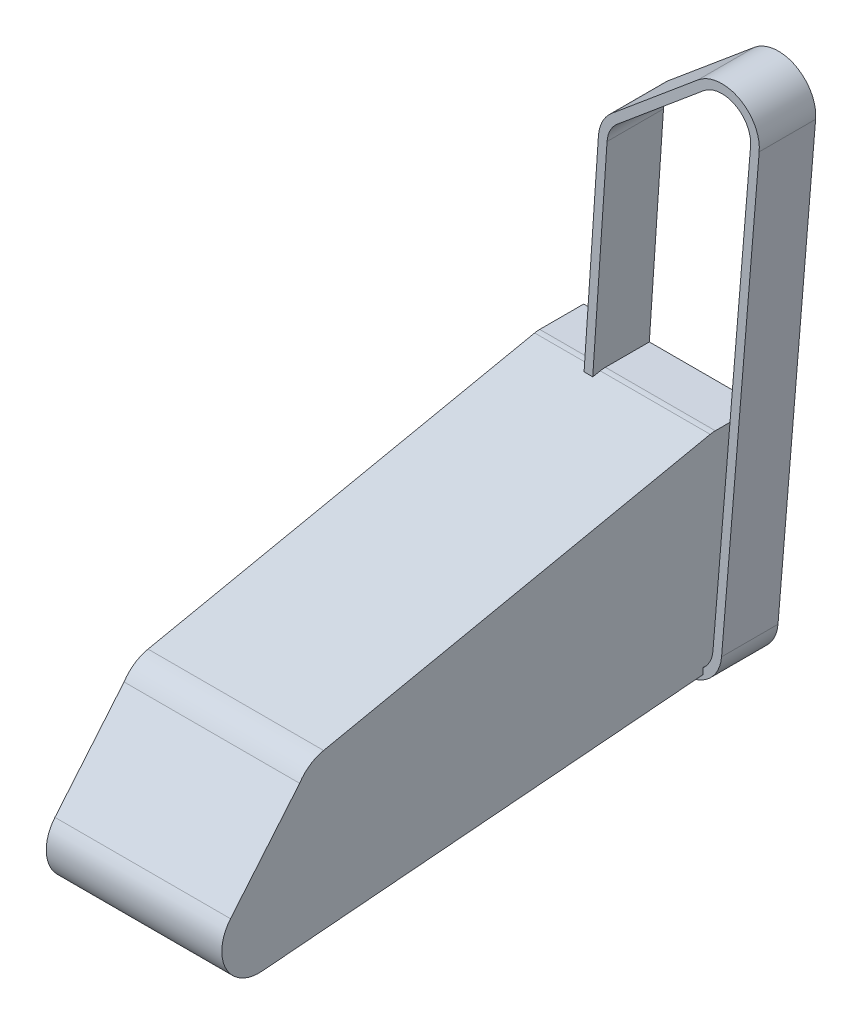
ISO-10303-21;
HEADER;
FILE_DESCRIPTION(('STEP AP214'),'2;1');
FILE_NAME('part.step','',(''),(''),'','','');
FILE_SCHEMA(('AUTOMOTIVE_DESIGN { 1 0 10303 214 1 1 1 1 }'));
ENDSEC;
DATA;
#1=APPLICATION_CONTEXT('core data for automotive mechanical design processes');
#2=APPLICATION_PROTOCOL_DEFINITION('international standard','automotive_design',2000,#1);
#3=PRODUCT_CONTEXT('',#1,'mechanical');
#4=PRODUCT('Part','Part','',(#3));
#5=PRODUCT_RELATED_PRODUCT_CATEGORY('part','',(#4));
#6=PRODUCT_DEFINITION_FORMATION('','',#4);
#7=PRODUCT_DEFINITION_CONTEXT('part definition',#1,'design');
#8=PRODUCT_DEFINITION('design','',#6,#7);
#9=PRODUCT_DEFINITION_SHAPE('','',#8);
#10=(LENGTH_UNIT() NAMED_UNIT(*) SI_UNIT(.MILLI.,.METRE.));
#11=(NAMED_UNIT(*) PLANE_ANGLE_UNIT() SI_UNIT($,.RADIAN.));
#12=(NAMED_UNIT(*) SI_UNIT($,.STERADIAN.) SOLID_ANGLE_UNIT());
#13=UNCERTAINTY_MEASURE_WITH_UNIT(LENGTH_MEASURE(1.E-05),#10,'distance_accuracy_value','');
#14=(GEOMETRIC_REPRESENTATION_CONTEXT(3) GLOBAL_UNCERTAINTY_ASSIGNED_CONTEXT((#13)) GLOBAL_UNIT_ASSIGNED_CONTEXT((#10,
#11,#12)) REPRESENTATION_CONTEXT('',''));
#15=CARTESIAN_POINT('',(0.,0.,0.));
#16=DIRECTION('',(0.,0.,1.));
#17=DIRECTION('',(1.,0.,0.));
#18=AXIS2_PLACEMENT_3D('',#15,#16,#17);
#19=CARTESIAN_POINT('',(-14.0026551876531,5.93465518765291,79.746));
#20=DIRECTION('',(1.,0.,0.));
#21=DIRECTION('',(0.,1.,0.));
#22=AXIS2_PLACEMENT_3D('',#19,#20,#21);
#23=CYLINDRICAL_SURFACE('',#22,5.95799999999999);
#24=DIRECTION('',(1.,0.,0.));
#25=VECTOR('',#24,1.);
#26=CARTESIAN_POINT('',(-14.0026551876531,-0.0031822441173314,79.2562545213397));
#27=LINE('',#26,#25);
#28=CARTESIAN_POINT('',(-14.0026551876531,-0.0031822441173314,79.2562545213397));
#29=VERTEX_POINT('',#28);
#30=CARTESIAN_POINT('',(13.997344812347,-0.00318224411742854,79.2562545213398));
#31=VERTEX_POINT('',#30);
#32=EDGE_CURVE('E147',#29,#31,#27,.T.);
#33=ORIENTED_EDGE('',*,*,#32,.T.);
#34=CARTESIAN_POINT('',(13.997344812347,5.93465518765281,79.7460000000001));
#35=DIRECTION('',(-1.,0.,0.));
#36=DIRECTION('',(0.,-1.,0.));
#37=AXIS2_PLACEMENT_3D('',#34,#35,#36);
#38=CIRCLE('',#37,5.95799999999999);
#39=CARTESIAN_POINT('',(13.997344812347,9.75573468257518,84.3173362918827));
#40=VERTEX_POINT('',#39);
#41=EDGE_CURVE('E141',#31,#40,#38,.T.);
#42=ORIENTED_EDGE('',*,*,#41,.T.);
#43=DIRECTION('',(1.,0.,0.));
#44=VECTOR('',#43,1.);
#45=CARTESIAN_POINT('',(-14.0026551876531,9.75573468257527,84.3173362918826));
#46=LINE('',#45,#44);
#47=CARTESIAN_POINT('',(-14.0026551876531,9.75573468257527,84.3173362918826));
#48=VERTEX_POINT('',#47);
#49=EDGE_CURVE('E12',#48,#40,#46,.T.);
#50=ORIENTED_EDGE('',*,*,#49,.F.);
#51=CARTESIAN_POINT('',(-14.0026551876531,5.93465518765291,79.746));
#52=DIRECTION('',(-1.,0.,0.));
#53=DIRECTION('',(0.,-1.,0.));
#54=AXIS2_PLACEMENT_3D('',#51,#52,#53);
#55=CIRCLE('',#54,5.95799999999999);
#56=EDGE_CURVE('E170',#29,#48,#55,.T.);
#57=ORIENTED_EDGE('',*,*,#56,.F.);
#58=EDGE_LOOP('',(#33,#42,#50,#57));
#59=FACE_BOUND('',#58,.T.);
#60=ADVANCED_FACE('F52',(#59),#23,.T.);
#61=CARTESIAN_POINT('',(-14.0026551876527,60.6387446850154,41.7853470121835));
#62=DIRECTION('',(0.,-0.641335934025239,-0.767260203404278));
#63=DIRECTION('',(0.,-0.767260203404278,0.641335934025239));
#64=AXIS2_PLACEMENT_3D('',#61,#62,#63);
#65=PLANE('',#64);
#66=ORIENTED_EDGE('',*,*,#49,.T.);
#67=DIRECTION('',(0.,0.767260203404279,-0.641335934025239));
#68=VECTOR('',#67,1.);
#69=CARTESIAN_POINT('',(13.9973448123473,60.6387446850153,41.7853470121836));
#70=LINE('',#69,#68);
#71=CARTESIAN_POINT('',(13.9973448123471,22.9445773426706,73.2930726996952));
#72=VERTEX_POINT('',#71);
#73=EDGE_CURVE('E131',#40,#72,#70,.T.);
#74=ORIENTED_EDGE('',*,*,#73,.T.);
#75=DIRECTION('',(1.,0.,0.));
#76=VECTOR('',#75,1.);
#77=CARTESIAN_POINT('',(-14.002655187653,22.9445773426707,73.2930726996951));
#78=LINE('',#77,#76);
#79=CARTESIAN_POINT('',(-14.002655187653,22.9445773426707,73.2930726996951));
#80=VERTEX_POINT('',#79);
#81=EDGE_CURVE('E59',#80,#72,#78,.T.);
#82=ORIENTED_EDGE('',*,*,#81,.F.);
#83=DIRECTION('',(0.,0.767260203404279,-0.641335934025239));
#84=VECTOR('',#83,1.);
#85=CARTESIAN_POINT('',(-14.0026551876527,60.6387446850154,41.7853470121835));
#86=LINE('',#85,#84);
#87=EDGE_CURVE('E132',#48,#80,#86,.T.);
#88=ORIENTED_EDGE('',*,*,#87,.F.);
#89=EDGE_LOOP('',(#66,#74,#82,#88));
#90=FACE_BOUND('',#89,.T.);
#91=ADVANCED_FACE('F129',(#90),#65,.F.);
#92=CARTESIAN_POINT('',(-14.002655187653,19.6926435850439,68.246));
#93=DIRECTION('',(1.,0.,0.));
#94=DIRECTION('',(0.,1.,0.));
#95=AXIS2_PLACEMENT_3D('',#92,#93,#94);
#96=CYLINDRICAL_SURFACE('',#95,6.004);
#97=ORIENTED_EDGE('',*,*,#81,.T.);
#98=CARTESIAN_POINT('',(13.9973448123471,19.6926435850438,68.2460000000001));
#99=DIRECTION('',(-1.,0.,0.));
#100=DIRECTION('',(0.,-1.,0.));
#101=AXIS2_PLACEMENT_3D('',#98,#99,#100);
#102=CIRCLE('',#101,6.004);
#103=CARTESIAN_POINT('',(13.9973448123471,25.5705925480758,69.4698186091051));
#104=VERTEX_POINT('',#103);
#105=EDGE_CURVE('E145',#72,#104,#102,.T.);
#106=ORIENTED_EDGE('',*,*,#105,.T.);
#107=DIRECTION('',(1.,0.,0.));
#108=VECTOR('',#107,1.);
#109=CARTESIAN_POINT('',(-14.002655187653,25.5705925480759,69.469818609105));
#110=LINE('',#109,#108);
#111=CARTESIAN_POINT('',(-14.002655187653,25.5705925480759,69.469818609105));
#112=VERTEX_POINT('',#111);
#113=EDGE_CURVE('E202',#112,#104,#110,.T.);
#114=ORIENTED_EDGE('',*,*,#113,.F.);
#115=CARTESIAN_POINT('',(-14.002655187653,19.6926435850439,68.246));
#116=DIRECTION('',(-1.,0.,0.));
#117=DIRECTION('',(0.,-1.,0.));
#118=AXIS2_PLACEMENT_3D('',#115,#116,#117);
#119=CIRCLE('',#118,6.004);
#120=EDGE_CURVE('E173',#80,#112,#119,.T.);
#121=ORIENTED_EDGE('',*,*,#120,.F.);
#122=EDGE_LOOP('',(#97,#106,#114,#121));
#123=FACE_BOUND('',#122,.T.);
#124=ADVANCED_FACE('F205',(#123),#96,.T.);
#125=CARTESIAN_POINT('',(-14.0026551876527,39.9757936009277,0.282247868701152));
#126=DIRECTION('',(0.,0.979005490178537,0.203833878931551));
#127=DIRECTION('',(0.,0.203833878931551,-0.979005490178537));
#128=AXIS2_PLACEMENT_3D('',#125,#126,#127);
#129=PLANE('',#128);
#130=ORIENTED_EDGE('',*,*,#113,.T.);
#131=DIRECTION('',(0.,-0.203833878931551,0.979005490178537));
#132=VECTOR('',#131,1.);
#133=CARTESIAN_POINT('',(13.9973448123474,39.9757936009276,0.282247868701249));
#134=LINE('',#133,#132);
#135=CARTESIAN_POINT('',(13.9973448123474,38.4073667730612,7.81533551572625));
#136=VERTEX_POINT('',#135);
#137=EDGE_CURVE('E151',#136,#104,#134,.T.);
#138=ORIENTED_EDGE('',*,*,#137,.F.);
#139=DIRECTION('',(1.,0.,0.));
#140=VECTOR('',#139,1.);
#141=CARTESIAN_POINT('',(-14.0026551876527,38.4073667730613,7.81533551572615));
#142=LINE('',#141,#140);
#143=CARTESIAN_POINT('',(-14.0026551876527,38.4073667730613,7.81533551572615));
#144=VERTEX_POINT('',#143);
#145=EDGE_CURVE('E200',#144,#136,#142,.T.);
#146=ORIENTED_EDGE('',*,*,#145,.F.);
#147=DIRECTION('',(0.,-0.203833878931551,0.979005490178537));
#148=VECTOR('',#147,1.);
#149=CARTESIAN_POINT('',(-14.0026551876527,39.9757936009277,0.282247868701152));
#150=LINE('',#149,#148);
#151=EDGE_CURVE('E175',#144,#112,#150,.T.);
#152=ORIENTED_EDGE('',*,*,#151,.T.);
#153=EDGE_LOOP('',(#130,#138,#146,#152));
#154=FACE_BOUND('',#153,.T.);
#155=ADVANCED_FACE('F212',(#154),#129,.T.);
#156=CARTESIAN_POINT('',(-14.0026551876527,34.4913448123472,6.99999999999994));
#157=DIRECTION('',(1.,0.,0.));
#158=DIRECTION('',(0.,1.,0.));
#159=AXIS2_PLACEMENT_3D('',#156,#157,#158);
#160=CYLINDRICAL_SURFACE('',#159,4.);
#161=ORIENTED_EDGE('',*,*,#145,.T.);
#162=CARTESIAN_POINT('',(13.9973448123473,34.4913448123471,7.00000000000004));
#163=DIRECTION('',(-1.,0.,0.));
#164=DIRECTION('',(0.,-1.,0.));
#165=AXIS2_PLACEMENT_3D('',#162,#163,#164);
#166=CIRCLE('',#165,4.);
#167=CARTESIAN_POINT('',(13.9973448123474,38.4913448123471,7.00000000000004));
#168=VERTEX_POINT('',#167);
#169=EDGE_CURVE('E153',#136,#168,#166,.T.);
#170=ORIENTED_EDGE('',*,*,#169,.T.);
#171=DIRECTION('',(1.,0.,0.));
#172=VECTOR('',#171,1.);
#173=CARTESIAN_POINT('',(-14.0026551876527,38.4913448123472,6.99999999999994));
#174=LINE('',#173,#172);
#175=CARTESIAN_POINT('',(-14.0026551876527,38.4913448123472,6.99999999999994));
#176=VERTEX_POINT('',#175);
#177=EDGE_CURVE('E198',#176,#168,#174,.T.);
#178=ORIENTED_EDGE('',*,*,#177,.F.);
#179=CARTESIAN_POINT('',(-14.0026551876527,34.4913448123472,6.99999999999994));
#180=DIRECTION('',(-1.,0.,0.));
#181=DIRECTION('',(0.,-1.,0.));
#182=AXIS2_PLACEMENT_3D('',#179,#180,#181);
#183=CIRCLE('',#182,4.);
#184=EDGE_CURVE('E178',#144,#176,#183,.T.);
#185=ORIENTED_EDGE('',*,*,#184,.F.);
#186=EDGE_LOOP('',(#161,#170,#178,#185));
#187=FACE_BOUND('',#186,.T.);
#188=ADVANCED_FACE('F216',(#187),#160,.T.);
#189=CARTESIAN_POINT('',(-14.0026551876527,38.4913448123472,-3.25400000000006));
#190=DIRECTION('',(0.,-1.,0.));
#191=DIRECTION('',(1.,0.,0.));
#192=AXIS2_PLACEMENT_3D('',#189,#190,#191);
#193=PLANE('',#192);
#194=ORIENTED_EDGE('',*,*,#177,.T.);
#195=DIRECTION('',(0.,0.,-1.));
#196=VECTOR('',#195,1.);
#197=CARTESIAN_POINT('',(13.9973448123474,38.4913448123471,-3.25399999999996));
#198=LINE('',#197,#196);
#199=CARTESIAN_POINT('',(13.9973448123474,38.4913448123471,-0.00399999999995543));
#200=VERTEX_POINT('',#199);
#201=EDGE_CURVE('E156',#168,#200,#198,.T.);
#202=ORIENTED_EDGE('',*,*,#201,.T.);
#203=DIRECTION('',(1.,0.,0.));
#204=VECTOR('',#203,1.);
#205=CARTESIAN_POINT('',(-14.0026551876527,38.4913448123472,-0.00400000000005257));
#206=LINE('',#205,#204);
#207=CARTESIAN_POINT('',(-14.0026551876527,38.4913448123472,-0.00400000000005257));
#208=VERTEX_POINT('',#207);
#209=EDGE_CURVE('E196',#208,#200,#206,.T.);
#210=ORIENTED_EDGE('',*,*,#209,.F.);
#211=DIRECTION('',(0.,0.,-1.));
#212=VECTOR('',#211,1.);
#213=CARTESIAN_POINT('',(-14.0026551876527,38.4913448123472,-3.25400000000006));
#214=LINE('',#213,#212);
#215=EDGE_CURVE('E180',#176,#208,#214,.T.);
#216=ORIENTED_EDGE('',*,*,#215,.F.);
#217=EDGE_LOOP('',(#194,#202,#210,#216));
#218=FACE_BOUND('',#217,.T.);
#219=ADVANCED_FACE('F221',(#218),#193,.F.);
#220=CARTESIAN_POINT('',(-14.0026551876527,22.9913448123472,-0.00400000000005257));
#221=DIRECTION('',(0.,0.,1.));
#222=DIRECTION('',(-1.,0.,0.));
#223=AXIS2_PLACEMENT_3D('',#220,#221,#222);
#224=PLANE('',#223);
#225=ORIENTED_EDGE('',*,*,#209,.T.);
#226=DIRECTION('',(0.,-1.,0.));
#227=VECTOR('',#226,1.);
#228=CARTESIAN_POINT('',(13.9973448123473,22.9913448123471,-0.00399999999995543));
#229=LINE('',#228,#227);
#230=CARTESIAN_POINT('',(13.9973448123473,7.93465518765281,-0.00399999999995543));
#231=VERTEX_POINT('',#230);
#232=EDGE_CURVE('E159',#200,#231,#229,.T.);
#233=ORIENTED_EDGE('',*,*,#232,.T.);
#234=DIRECTION('',(1.,0.,0.));
#235=VECTOR('',#234,1.);
#236=CARTESIAN_POINT('',(-14.0026551876528,7.93465518765291,-0.00400000000005257));
#237=LINE('',#236,#235);
#238=CARTESIAN_POINT('',(-14.0026551876528,7.93465518765291,-0.00400000000005257));
#239=VERTEX_POINT('',#238);
#240=EDGE_CURVE('E194',#239,#231,#237,.T.);
#241=ORIENTED_EDGE('',*,*,#240,.F.);
#242=DIRECTION('',(0.,-1.,0.));
#243=VECTOR('',#242,1.);
#244=CARTESIAN_POINT('',(-14.0026551876527,22.9913448123472,-0.00400000000005257));
#245=LINE('',#244,#243);
#246=EDGE_CURVE('E182',#208,#239,#245,.T.);
#247=ORIENTED_EDGE('',*,*,#246,.F.);
#248=EDGE_LOOP('',(#225,#233,#241,#247));
#249=FACE_BOUND('',#248,.T.);
#250=ADVANCED_FACE('F225',(#249),#224,.F.);
#251=CARTESIAN_POINT('',(-14.0026551876528,7.93465518765291,-3.25400000000006));
#252=DIRECTION('',(0.,-1.,0.));
#253=DIRECTION('',(1.,0.,0.));
#254=AXIS2_PLACEMENT_3D('',#251,#252,#253);
#255=PLANE('',#254);
#256=ORIENTED_EDGE('',*,*,#240,.T.);
#257=DIRECTION('',(0.,0.,-1.));
#258=VECTOR('',#257,1.);
#259=CARTESIAN_POINT('',(13.9973448123473,7.93465518765281,-3.25399999999996));
#260=LINE('',#259,#258);
#261=CARTESIAN_POINT('',(13.9973448123473,7.93465518765281,2.52786404500047));
#262=VERTEX_POINT('',#261);
#263=EDGE_CURVE('E162',#262,#231,#260,.T.);
#264=ORIENTED_EDGE('',*,*,#263,.F.);
#265=DIRECTION('',(1.,0.,0.));
#266=VECTOR('',#265,1.);
#267=CARTESIAN_POINT('',(-14.0026551876528,7.93465518765291,2.52786404500037));
#268=LINE('',#267,#266);
#269=CARTESIAN_POINT('',(-14.0026551876528,7.93465518765291,2.52786404500037));
#270=VERTEX_POINT('',#269);
#271=EDGE_CURVE('E192',#270,#262,#268,.T.);
#272=ORIENTED_EDGE('',*,*,#271,.F.);
#273=DIRECTION('',(0.,0.,-1.));
#274=VECTOR('',#273,1.);
#275=CARTESIAN_POINT('',(-14.0026551876528,7.93465518765291,-3.25400000000006));
#276=LINE('',#275,#274);
#277=EDGE_CURVE('E184',#270,#239,#276,.T.);
#278=ORIENTED_EDGE('',*,*,#277,.T.);
#279=EDGE_LOOP('',(#256,#264,#272,#278));
#280=FACE_BOUND('',#279,.T.);
#281=ADVANCED_FACE('F229',(#280),#255,.T.);
#282=CARTESIAN_POINT('',(-14.0026551876528,11.9346551876529,6.99999999999994));
#283=DIRECTION('',(1.,0.,0.));
#284=DIRECTION('',(0.,1.,0.));
#285=AXIS2_PLACEMENT_3D('',#282,#283,#284);
#286=CYLINDRICAL_SURFACE('',#285,5.99999999999999);
#287=ORIENTED_EDGE('',*,*,#271,.T.);
#288=CARTESIAN_POINT('',(13.9973448123473,11.9346551876528,7.00000000000004));
#289=DIRECTION('',(-1.,0.,0.));
#290=DIRECTION('',(0.,-1.,0.));
#291=AXIS2_PLACEMENT_3D('',#288,#289,#290);
#292=CIRCLE('',#291,5.99999999999999);
#293=CARTESIAN_POINT('',(13.9973448123472,5.93856401011291,7.21654235296627));
#294=VERTEX_POINT('',#293);
#295=EDGE_CURVE('E165',#262,#294,#292,.T.);
#296=ORIENTED_EDGE('',*,*,#295,.T.);
#297=DIRECTION('',(1.,0.,0.));
#298=VECTOR('',#297,1.);
#299=CARTESIAN_POINT('',(-14.0026551876528,5.93856401011301,7.21654235296618));
#300=LINE('',#299,#298);
#301=CARTESIAN_POINT('',(-14.0026551876528,5.93856401011301,7.21654235296618));
#302=VERTEX_POINT('',#301);
#303=EDGE_CURVE('E190',#302,#294,#300,.T.);
#304=ORIENTED_EDGE('',*,*,#303,.F.);
#305=CARTESIAN_POINT('',(-14.0026551876528,11.9346551876529,6.99999999999994));
#306=DIRECTION('',(-1.,0.,0.));
#307=DIRECTION('',(0.,-1.,0.));
#308=AXIS2_PLACEMENT_3D('',#305,#306,#307);
#309=CIRCLE('',#308,5.99999999999999);
#310=EDGE_CURVE('E71',#270,#302,#309,.T.);
#311=ORIENTED_EDGE('',*,*,#310,.F.);
#312=EDGE_LOOP('',(#287,#296,#304,#311));
#313=FACE_BOUND('',#312,.T.);
#314=ADVANCED_FACE('F232',(#313),#286,.T.);
#315=CARTESIAN_POINT('',(-14.0026551876528,6.91154815248477,-4.58024171719652));
#316=DIRECTION('',(0.,0.996615883143713,0.0821996439510388));
#317=DIRECTION('',(0.,0.0821996439510388,-0.996615883143713));
#318=AXIS2_PLACEMENT_3D('',#315,#316,#317);
#319=PLANE('',#318);
#320=ORIENTED_EDGE('',*,*,#303,.T.);
#321=DIRECTION('',(0.,-0.0821996439510388,0.996615883143713));
#322=VECTOR('',#321,1.);
#323=CARTESIAN_POINT('',(13.9973448123473,6.91154815248468,-4.58024171719643));
#324=LINE('',#323,#322);
#325=EDGE_CURVE('E168',#294,#31,#324,.T.);
#326=ORIENTED_EDGE('',*,*,#325,.T.);
#327=ORIENTED_EDGE('',*,*,#32,.F.);
#328=DIRECTION('',(0.,-0.0821996439510388,0.996615883143713));
#329=VECTOR('',#328,1.);
#330=CARTESIAN_POINT('',(-14.0026551876528,6.91154815248477,-4.58024171719652));
#331=LINE('',#330,#329);
#332=EDGE_CURVE('E66',#302,#29,#331,.T.);
#333=ORIENTED_EDGE('',*,*,#332,.F.);
#334=EDGE_LOOP('',(#320,#326,#327,#333));
#335=FACE_BOUND('',#334,.T.);
#336=ADVANCED_FACE('F234',(#335),#319,.F.);
#337=CARTESIAN_POINT('',(-14.0026551876527,22.9913448123472,-3.25400000000006));
#338=DIRECTION('',(-1.,0.,0.));
#339=DIRECTION('',(0.,-1.,0.));
#340=AXIS2_PLACEMENT_3D('',#337,#338,#339);
#341=PLANE('',#340);
#342=ORIENTED_EDGE('',*,*,#56,.T.);
#343=ORIENTED_EDGE('',*,*,#87,.T.);
#344=ORIENTED_EDGE('',*,*,#120,.T.);
#345=ORIENTED_EDGE('',*,*,#151,.F.);
#346=ORIENTED_EDGE('',*,*,#184,.T.);
#347=ORIENTED_EDGE('',*,*,#215,.T.);
#348=ORIENTED_EDGE('',*,*,#246,.T.);
#349=ORIENTED_EDGE('',*,*,#277,.F.);
#350=ORIENTED_EDGE('',*,*,#310,.T.);
#351=ORIENTED_EDGE('',*,*,#332,.T.);
#352=EDGE_LOOP('',(#342,#343,#344,#345,#346,#347,#348,#349,#350,#351));
#353=FACE_BOUND('',#352,.T.);
#354=ADVANCED_FACE('F208',(#353),#341,.T.);
#355=CARTESIAN_POINT('',(13.9973448123473,22.9913448123471,-3.25399999999996));
#356=DIRECTION('',(-1.,0.,0.));
#357=DIRECTION('',(0.,-1.,0.));
#358=AXIS2_PLACEMENT_3D('',#355,#356,#357);
#359=PLANE('',#358);
#360=ORIENTED_EDGE('',*,*,#41,.F.);
#361=ORIENTED_EDGE('',*,*,#325,.F.);
#362=ORIENTED_EDGE('',*,*,#295,.F.);
#363=ORIENTED_EDGE('',*,*,#263,.T.);
#364=ORIENTED_EDGE('',*,*,#232,.F.);
#365=ORIENTED_EDGE('',*,*,#201,.F.);
#366=ORIENTED_EDGE('',*,*,#169,.F.);
#367=ORIENTED_EDGE('',*,*,#137,.T.);
#368=ORIENTED_EDGE('',*,*,#105,.F.);
#369=ORIENTED_EDGE('',*,*,#73,.F.);
#370=EDGE_LOOP('',(#360,#361,#362,#363,#364,#365,#366,#367,#368,#369));
#371=FACE_BOUND('',#370,.T.);
#372=ADVANCED_FACE('F139',(#371),#359,.F.);
#373=CLOSED_SHELL('',(#60,#91,#124,#155,#188,#219,#250,#281,#314,#336,#354,#372));
#374=MANIFOLD_SOLID_BREP('B2',#373);
#375=CARTESIAN_POINT('',(17.0566896246943,83.,9.));
#376=DIRECTION('',(0.,0.,-1.));
#377=DIRECTION('',(-1.,0.,0.));
#378=AXIS2_PLACEMENT_3D('',#375,#376,#377);
#379=CYLINDRICAL_SURFACE('',#378,4.57799999999999);
#380=CARTESIAN_POINT('',(17.0566896246943,83.,0.));
#381=DIRECTION('',(0.,0.,1.));
#382=DIRECTION('',(1.,0.,0.));
#383=AXIS2_PLACEMENT_3D('',#380,#381,#382);
#384=CIRCLE('',#383,4.57799999999999);
#385=CARTESIAN_POINT('',(21.6191971377262,82.6236900299922,0.));
#386=VERTEX_POINT('',#385);
#387=CARTESIAN_POINT('',(14.1206537187267,86.5125172111848,0.));
#388=VERTEX_POINT('',#387);
#389=EDGE_CURVE('E532',#386,#388,#384,.T.);
#390=ORIENTED_EDGE('',*,*,#389,.F.);
#391=DIRECTION('',(0.,0.,-1.));
#392=VECTOR('',#391,1.);
#393=CARTESIAN_POINT('',(21.6191971377262,82.6236900299922,9.));
#394=LINE('',#393,#392);
#395=CARTESIAN_POINT('',(21.6191971377262,82.6236900299922,9.));
#396=VERTEX_POINT('',#395);
#397=EDGE_CURVE('E50',#396,#386,#394,.T.);
#398=ORIENTED_EDGE('',*,*,#397,.F.);
#399=CARTESIAN_POINT('',(17.0566896246943,83.,9.));
#400=DIRECTION('',(0.,0.,1.));
#401=DIRECTION('',(1.,0.,0.));
#402=AXIS2_PLACEMENT_3D('',#399,#400,#401);
#403=CIRCLE('',#402,4.57799999999999);
#404=CARTESIAN_POINT('',(14.1206537187267,86.5125172111848,9.));
#405=VERTEX_POINT('',#404);
#406=EDGE_CURVE('E617',#396,#405,#403,.T.);
#407=ORIENTED_EDGE('',*,*,#406,.T.);
#408=DIRECTION('',(0.,0.,-1.));
#409=VECTOR('',#408,1.);
#410=CARTESIAN_POINT('',(14.1206537187267,86.5125172111848,9.));
#411=LINE('',#410,#409);
#412=EDGE_CURVE('E384',#405,#388,#411,.T.);
#413=ORIENTED_EDGE('',*,*,#412,.T.);
#414=EDGE_LOOP('',(#390,#398,#407,#413));
#415=FACE_BOUND('',#414,.T.);
#416=ADVANCED_FACE('F365',(#415),#379,.F.);
#417=CARTESIAN_POINT('',(14.7044667411241,-1.21280620854404,9.));
#418=DIRECTION('',(-0.996615883143713,0.0821996439510388,0.));
#419=DIRECTION('',(-0.0821996439510388,-0.996615883143713,0.));
#420=AXIS2_PLACEMENT_3D('',#417,#418,#419);
#421=PLANE('',#420);
#422=DIRECTION('',(0.0821996439510388,0.996615883143713,0.));
#423=VECTOR('',#422,1.);
#424=CARTESIAN_POINT('',(14.7044667411241,-1.21280620854404,0.));
#425=LINE('',#424,#423);
#426=CARTESIAN_POINT('',(15.6191971377262,9.87769002999214,0.));
#427=VERTEX_POINT('',#426);
#428=EDGE_CURVE('E534',#427,#386,#425,.T.);
#429=ORIENTED_EDGE('',*,*,#428,.F.);
#430=DIRECTION('',(0.,0.,-1.));
#431=VECTOR('',#430,1.);
#432=CARTESIAN_POINT('',(15.6191971377262,9.87769002999214,9.));
#433=LINE('',#432,#431);
#434=CARTESIAN_POINT('',(15.6191971377262,9.87769002999214,9.));
#435=VERTEX_POINT('',#434);
#436=EDGE_CURVE('E375',#435,#427,#433,.T.);
#437=ORIENTED_EDGE('',*,*,#436,.F.);
#438=DIRECTION('',(0.0821996439510388,0.996615883143713,0.));
#439=VECTOR('',#438,1.);
#440=CARTESIAN_POINT('',(14.7044667411241,-1.21280620854404,9.));
#441=LINE('',#440,#439);
#442=EDGE_CURVE('E619',#435,#396,#441,.T.);
#443=ORIENTED_EDGE('',*,*,#442,.T.);
#444=ORIENTED_EDGE('',*,*,#397,.T.);
#445=EDGE_LOOP('',(#429,#437,#443,#444));
#446=FACE_BOUND('',#445,.T.);
#447=ADVANCED_FACE('F646',(#446),#421,.T.);
#448=CARTESIAN_POINT('',(11.0566896246943,10.254,9.));
#449=DIRECTION('',(0.,0.,-1.));
#450=DIRECTION('',(-1.,0.,0.));
#451=AXIS2_PLACEMENT_3D('',#448,#449,#450);
#452=CYLINDRICAL_SURFACE('',#451,4.578);
#453=CARTESIAN_POINT('',(11.0566896246943,10.254,0.));
#454=DIRECTION('',(0.,0.,1.));
#455=DIRECTION('',(1.,0.,0.));
#456=AXIS2_PLACEMENT_3D('',#453,#454,#455);
#457=CIRCLE('',#456,4.578);
#458=CARTESIAN_POINT('',(11.0566896246943,5.676,0.));
#459=VERTEX_POINT('',#458);
#460=EDGE_CURVE('E537',#459,#427,#457,.T.);
#461=ORIENTED_EDGE('',*,*,#460,.F.);
#462=DIRECTION('',(0.,0.,-1.));
#463=VECTOR('',#462,1.);
#464=CARTESIAN_POINT('',(11.0566896246943,5.676,9.));
#465=LINE('',#464,#463);
#466=CARTESIAN_POINT('',(11.0566896246943,5.676,9.));
#467=VERTEX_POINT('',#466);
#468=EDGE_CURVE('E558',#467,#459,#465,.T.);
#469=ORIENTED_EDGE('',*,*,#468,.F.);
#470=CARTESIAN_POINT('',(11.0566896246943,10.254,9.));
#471=DIRECTION('',(0.,0.,1.));
#472=DIRECTION('',(1.,0.,0.));
#473=AXIS2_PLACEMENT_3D('',#470,#471,#472);
#474=CIRCLE('',#473,4.578);
#475=EDGE_CURVE('E622',#467,#435,#474,.T.);
#476=ORIENTED_EDGE('',*,*,#475,.T.);
#477=ORIENTED_EDGE('',*,*,#436,.T.);
#478=EDGE_LOOP('',(#461,#469,#476,#477));
#479=FACE_BOUND('',#478,.T.);
#480=ADVANCED_FACE('F651',(#479),#452,.F.);
#481=CARTESIAN_POINT('',(0.,5.67599999999999,9.));
#482=DIRECTION('',(0.,1.,0.));
#483=DIRECTION('',(-1.,0.,0.));
#484=AXIS2_PLACEMENT_3D('',#481,#482,#483);
#485=PLANE('',#484);
#486=DIRECTION('',(1.,0.,0.));
#487=VECTOR('',#486,1.);
#488=CARTESIAN_POINT('',(0.,5.67599999999999,0.));
#489=LINE('',#488,#487);
#490=CARTESIAN_POINT('',(-1.44331037530571,5.67599999999999,0.));
#491=VERTEX_POINT('',#490);
#492=EDGE_CURVE('E540',#491,#459,#489,.T.);
#493=ORIENTED_EDGE('',*,*,#492,.F.);
#494=DIRECTION('',(0.,0.,-1.));
#495=VECTOR('',#494,1.);
#496=CARTESIAN_POINT('',(-1.44331037530571,5.67599999999999,9.));
#497=LINE('',#496,#495);
#498=CARTESIAN_POINT('',(-1.44331037530571,5.67599999999999,9.));
#499=VERTEX_POINT('',#498);
#500=EDGE_CURVE('E556',#499,#491,#497,.T.);
#501=ORIENTED_EDGE('',*,*,#500,.F.);
#502=DIRECTION('',(1.,0.,0.));
#503=VECTOR('',#502,1.);
#504=CARTESIAN_POINT('',(0.,5.67599999999999,9.));
#505=LINE('',#504,#503);
#506=EDGE_CURVE('E625',#499,#467,#505,.T.);
#507=ORIENTED_EDGE('',*,*,#506,.T.);
#508=ORIENTED_EDGE('',*,*,#468,.T.);
#509=EDGE_LOOP('',(#493,#501,#507,#508));
#510=FACE_BOUND('',#509,.T.);
#511=ADVANCED_FACE('F684',(#510),#485,.T.);
#512=CARTESIAN_POINT('',(-1.44331037530571,9.705,9.));
#513=DIRECTION('',(0.,0.,-1.));
#514=DIRECTION('',(-1.,0.,0.));
#515=AXIS2_PLACEMENT_3D('',#512,#513,#514);
#516=CYLINDRICAL_SURFACE('',#515,4.029);
#517=CARTESIAN_POINT('',(-1.44331037530571,9.705,0.));
#518=DIRECTION('',(0.,0.,1.));
#519=DIRECTION('',(1.,0.,0.));
#520=AXIS2_PLACEMENT_3D('',#517,#518,#519);
#521=CIRCLE('',#520,4.029);
#522=CARTESIAN_POINT('',(-5.46307284786455,9.97767318204715,0.));
#523=VERTEX_POINT('',#522);
#524=EDGE_CURVE('E543',#523,#491,#521,.T.);
#525=ORIENTED_EDGE('',*,*,#524,.F.);
#526=DIRECTION('',(0.,0.,-1.));
#527=VECTOR('',#526,1.);
#528=CARTESIAN_POINT('',(-5.46307284786455,9.97767318204715,9.));
#529=LINE('',#528,#527);
#530=CARTESIAN_POINT('',(-5.46307284786455,9.97767318204715,9.));
#531=VERTEX_POINT('',#530);
#532=EDGE_CURVE('E495',#531,#523,#529,.T.);
#533=ORIENTED_EDGE('',*,*,#532,.F.);
#534=CARTESIAN_POINT('',(-1.44331037530571,9.705,9.));
#535=DIRECTION('',(0.,0.,1.));
#536=DIRECTION('',(1.,0.,0.));
#537=AXIS2_PLACEMENT_3D('',#534,#535,#536);
#538=CIRCLE('',#537,4.029);
#539=EDGE_CURVE('E506',#531,#499,#538,.T.);
#540=ORIENTED_EDGE('',*,*,#539,.T.);
#541=ORIENTED_EDGE('',*,*,#500,.T.);
#542=EDGE_LOOP('',(#525,#533,#540,#541));
#543=FACE_BOUND('',#542,.T.);
#544=ADVANCED_FACE('F629',(#543),#516,.F.);
#545=CARTESIAN_POINT('',(-6.11176762282017,0.414580497485598,9.));
#546=DIRECTION('',(0.99770724064503,-0.0676776326749048,0.));
#547=DIRECTION('',(0.0676776326749048,0.99770724064503,0.));
#548=AXIS2_PLACEMENT_3D('',#545,#546,#547);
#549=PLANE('',#548);
#550=DIRECTION('',(-0.0676776326749048,-0.99770724064503,0.));
#551=VECTOR('',#550,1.);
#552=CARTESIAN_POINT('',(-6.11176762282017,0.414580497485598,0.));
#553=LINE('',#552,#551);
#554=CARTESIAN_POINT('',(-1.26880252036967,71.8098282023857,0.));
#555=VERTEX_POINT('',#554);
#556=EDGE_CURVE('E491',#555,#523,#553,.T.);
#557=ORIENTED_EDGE('',*,*,#556,.F.);
#558=DIRECTION('',(0.,0.,-1.));
#559=VECTOR('',#558,1.);
#560=CARTESIAN_POINT('',(-1.26880252036967,71.8098282023857,9.));
#561=LINE('',#560,#559);
#562=CARTESIAN_POINT('',(-1.26880252036967,71.8098282023857,9.));
#563=VERTEX_POINT('',#562);
#564=EDGE_CURVE('E486',#563,#555,#561,.T.);
#565=ORIENTED_EDGE('',*,*,#564,.F.);
#566=DIRECTION('',(-0.0676776326749048,-0.99770724064503,0.));
#567=VECTOR('',#566,1.);
#568=CARTESIAN_POINT('',(-6.11176762282017,0.414580497485598,9.));
#569=LINE('',#568,#567);
#570=EDGE_CURVE('E489',#563,#531,#569,.T.);
#571=ORIENTED_EDGE('',*,*,#570,.T.);
#572=ORIENTED_EDGE('',*,*,#532,.T.);
#573=EDGE_LOOP('',(#557,#565,#571,#572));
#574=FACE_BOUND('',#573,.T.);
#575=ADVANCED_FACE('F488',(#574),#549,.T.);
#576=CARTESIAN_POINT('',(3.29870122730328,71.5,9.));
#577=DIRECTION('',(0.,0.,-1.));
#578=DIRECTION('',(-1.,0.,0.));
#579=AXIS2_PLACEMENT_3D('',#576,#577,#578);
#580=CYLINDRICAL_SURFACE('',#579,4.578);
#581=CARTESIAN_POINT('',(3.29870122730328,71.5,0.));
#582=DIRECTION('',(0.,0.,1.));
#583=DIRECTION('',(1.,0.,0.));
#584=AXIS2_PLACEMENT_3D('',#581,#582,#583);
#585=CIRCLE('',#584,4.578);
#586=CARTESIAN_POINT('',(0.362665321335727,75.0125172111848,0.));
#587=VERTEX_POINT('',#586);
#588=EDGE_CURVE('E547',#587,#555,#585,.T.);
#589=ORIENTED_EDGE('',*,*,#588,.F.);
#590=DIRECTION('',(0.,0.,-1.));
#591=VECTOR('',#590,1.);
#592=CARTESIAN_POINT('',(0.362665321335727,75.0125172111848,9.));
#593=LINE('',#592,#591);
#594=CARTESIAN_POINT('',(0.362665321335727,75.0125172111848,9.));
#595=VERTEX_POINT('',#594);
#596=EDGE_CURVE('E433',#595,#587,#593,.T.);
#597=ORIENTED_EDGE('',*,*,#596,.F.);
#598=CARTESIAN_POINT('',(3.29870122730328,71.5,9.));
#599=DIRECTION('',(0.,0.,1.));
#600=DIRECTION('',(1.,0.,0.));
#601=AXIS2_PLACEMENT_3D('',#598,#599,#600);
#602=CIRCLE('',#601,4.578);
#603=EDGE_CURVE('E503',#595,#563,#602,.T.);
#604=ORIENTED_EDGE('',*,*,#603,.T.);
#605=ORIENTED_EDGE('',*,*,#564,.T.);
#606=EDGE_LOOP('',(#589,#597,#604,#605));
#607=FACE_BOUND('',#606,.T.);
#608=ADVANCED_FACE('F508',(#607),#580,.F.);
#609=CARTESIAN_POINT('',(16.0797966598624,-1.32624171719647,9.));
#610=DIRECTION('',(-0.996615883143713,0.0821996439510388,0.));
#611=DIRECTION('',(-0.0821996439510388,-0.996615883143713,0.));
#612=AXIS2_PLACEMENT_3D('',#609,#610,#611);
#613=PLANE('',#612);
#614=DIRECTION('',(0.0821996439510388,0.996615883143713,0.));
#615=VECTOR('',#614,1.);
#616=CARTESIAN_POINT('',(16.0797966598624,-1.32624171719647,0.));
#617=LINE('',#616,#615);
#618=CARTESIAN_POINT('',(16.9945270564645,9.76425452133971,0.));
#619=VERTEX_POINT('',#618);
#620=CARTESIAN_POINT('',(22.9945270564645,82.5102545213397,0.));
#621=VERTEX_POINT('',#620);
#622=EDGE_CURVE('E515',#619,#621,#617,.T.);
#623=ORIENTED_EDGE('',*,*,#622,.T.);
#624=DIRECTION('',(0.,0.,-1.));
#625=VECTOR('',#624,1.);
#626=CARTESIAN_POINT('',(22.9945270564645,82.5102545213397,9.));
#627=LINE('',#626,#625);
#628=CARTESIAN_POINT('',(22.9945270564645,82.5102545213397,9.));
#629=VERTEX_POINT('',#628);
#630=EDGE_CURVE('E369',#629,#621,#627,.T.);
#631=ORIENTED_EDGE('',*,*,#630,.F.);
#632=DIRECTION('',(0.0821996439510388,0.996615883143713,0.));
#633=VECTOR('',#632,1.);
#634=CARTESIAN_POINT('',(16.0797966598624,-1.32624171719647,9.));
#635=LINE('',#634,#633);
#636=CARTESIAN_POINT('',(16.9945270564645,9.76425452133971,9.));
#637=VERTEX_POINT('',#636);
#638=EDGE_CURVE('E552',#637,#629,#635,.T.);
#639=ORIENTED_EDGE('',*,*,#638,.F.);
#640=DIRECTION('',(0.,0.,-1.));
#641=VECTOR('',#640,1.);
#642=CARTESIAN_POINT('',(16.9945270564645,9.76425452133971,9.));
#643=LINE('',#642,#641);
#644=EDGE_CURVE('E511',#637,#619,#643,.T.);
#645=ORIENTED_EDGE('',*,*,#644,.T.);
#646=EDGE_LOOP('',(#623,#631,#639,#645));
#647=FACE_BOUND('',#646,.T.);
#648=ADVANCED_FACE('F367',(#647),#613,.F.);
#649=CARTESIAN_POINT('',(17.0566896246943,83.,9.));
#650=DIRECTION('',(0.,0.,-1.));
#651=DIRECTION('',(-1.,0.,0.));
#652=AXIS2_PLACEMENT_3D('',#649,#650,#651);
#653=CYLINDRICAL_SURFACE('',#652,5.95799999999999);
#654=CARTESIAN_POINT('',(17.0566896246943,83.,0.));
#655=DIRECTION('',(0.,0.,1.));
#656=DIRECTION('',(1.,0.,0.));
#657=AXIS2_PLACEMENT_3D('',#654,#655,#656);
#658=CIRCLE('',#657,5.95799999999999);
#659=CARTESIAN_POINT('',(13.2356101297719,87.5713362918827,0.));
#660=VERTEX_POINT('',#659);
#661=EDGE_CURVE('E518',#621,#660,#658,.T.);
#662=ORIENTED_EDGE('',*,*,#661,.T.);
#663=DIRECTION('',(0.,0.,-1.));
#664=VECTOR('',#663,1.);
#665=CARTESIAN_POINT('',(13.2356101297719,87.5713362918827,9.));
#666=LINE('',#665,#664);
#667=CARTESIAN_POINT('',(13.2356101297719,87.5713362918827,9.));
#668=VERTEX_POINT('',#667);
#669=EDGE_CURVE('E577',#668,#660,#666,.T.);
#670=ORIENTED_EDGE('',*,*,#669,.F.);
#671=CARTESIAN_POINT('',(17.0566896246943,83.,9.));
#672=DIRECTION('',(0.,0.,1.));
#673=DIRECTION('',(1.,0.,0.));
#674=AXIS2_PLACEMENT_3D('',#671,#672,#673);
#675=CIRCLE('',#674,5.95799999999999);
#676=EDGE_CURVE('E446',#629,#668,#675,.T.);
#677=ORIENTED_EDGE('',*,*,#676,.F.);
#678=ORIENTED_EDGE('',*,*,#630,.T.);
#679=EDGE_LOOP('',(#662,#670,#677,#678));
#680=FACE_BOUND('',#679,.T.);
#681=ADVANCED_FACE('F583',(#680),#653,.T.);
#682=CARTESIAN_POINT('',(-37.6473998726682,45.0393470121835,9.));
#683=DIRECTION('',(0.641335934025239,-0.767260203404278,0.));
#684=DIRECTION('',(0.767260203404278,0.641335934025239,0.));
#685=AXIS2_PLACEMENT_3D('',#682,#683,#684);
#686=PLANE('',#685);
#687=DIRECTION('',(-0.767260203404278,-0.641335934025239,0.));
#688=VECTOR('',#687,1.);
#689=CARTESIAN_POINT('',(-37.6473998726682,45.0393470121835,0.));
#690=LINE('',#689,#688);
#691=CARTESIAN_POINT('',(-0.522378267619104,76.0713362918827,0.));
#692=VERTEX_POINT('',#691);
#693=EDGE_CURVE('E520',#660,#692,#690,.T.);
#694=ORIENTED_EDGE('',*,*,#693,.T.);
#695=DIRECTION('',(0.,0.,-1.));
#696=VECTOR('',#695,1.);
#697=CARTESIAN_POINT('',(-0.522378267619104,76.0713362918827,9.));
#698=LINE('',#697,#696);
#699=CARTESIAN_POINT('',(-0.522378267619104,76.0713362918827,9.));
#700=VERTEX_POINT('',#699);
#701=EDGE_CURVE('E575',#700,#692,#698,.T.);
#702=ORIENTED_EDGE('',*,*,#701,.F.);
#703=DIRECTION('',(-0.767260203404278,-0.641335934025239,0.));
#704=VECTOR('',#703,1.);
#705=CARTESIAN_POINT('',(-37.6473998726682,45.0393470121835,9.));
#706=LINE('',#705,#704);
#707=EDGE_CURVE('E605',#668,#700,#706,.T.);
#708=ORIENTED_EDGE('',*,*,#707,.F.);
#709=ORIENTED_EDGE('',*,*,#669,.T.);
#710=EDGE_LOOP('',(#694,#702,#708,#709));
#711=FACE_BOUND('',#710,.T.);
#712=ADVANCED_FACE('F596',(#711),#686,.F.);
#713=CARTESIAN_POINT('',(3.29870122730328,71.5,9.));
#714=DIRECTION('',(0.,0.,-1.));
#715=DIRECTION('',(-1.,0.,0.));
#716=AXIS2_PLACEMENT_3D('',#713,#714,#715);
#717=CYLINDRICAL_SURFACE('',#716,5.95800000000001);
#718=CARTESIAN_POINT('',(3.29870122730328,71.5,0.));
#719=DIRECTION('',(0.,0.,1.));
#720=DIRECTION('',(1.,0.,0.));
#721=AXIS2_PLACEMENT_3D('',#718,#719,#720);
#722=CIRCLE('',#721,5.95800000000001);
#723=CARTESIAN_POINT('',(-2.64563851245982,71.9032233354771,0.));
#724=VERTEX_POINT('',#723);
#725=EDGE_CURVE('E522',#692,#724,#722,.T.);
#726=ORIENTED_EDGE('',*,*,#725,.T.);
#727=DIRECTION('',(0.,0.,-1.));
#728=VECTOR('',#727,1.);
#729=CARTESIAN_POINT('',(-2.64563851245982,71.9032233354771,9.));
#730=LINE('',#729,#728);
#731=CARTESIAN_POINT('',(-2.64563851245982,71.9032233354771,9.));
#732=VERTEX_POINT('',#731);
#733=EDGE_CURVE('E572',#732,#724,#730,.T.);
#734=ORIENTED_EDGE('',*,*,#733,.F.);
#735=CARTESIAN_POINT('',(3.29870122730328,71.5,9.));
#736=DIRECTION('',(0.,0.,1.));
#737=DIRECTION('',(1.,0.,0.));
#738=AXIS2_PLACEMENT_3D('',#735,#736,#737);
#739=CIRCLE('',#738,5.95800000000001);
#740=EDGE_CURVE('E601',#700,#732,#739,.T.);
#741=ORIENTED_EDGE('',*,*,#740,.F.);
#742=ORIENTED_EDGE('',*,*,#701,.T.);
#743=EDGE_LOOP('',(#726,#734,#741,#742));
#744=FACE_BOUND('',#743,.T.);
#745=ADVANCED_FACE('F599',(#744),#717,.T.);
#746=CARTESIAN_POINT('',(-7.48860361491031,0.507975630576966,9.));
#747=DIRECTION('',(0.99770724064503,-0.0676776326749047,0.));
#748=DIRECTION('',(0.0676776326749047,0.99770724064503,0.));
#749=AXIS2_PLACEMENT_3D('',#746,#747,#748);
#750=PLANE('',#749);
#751=DIRECTION('',(-0.0676776326749047,-0.99770724064503,0.));
#752=VECTOR('',#751,1.);
#753=CARTESIAN_POINT('',(-7.48860361491031,0.507975630576966,0.));
#754=LINE('',#753,#752);
#755=CARTESIAN_POINT('',(-6.83990883995469,10.0710683151385,0.));
#756=VERTEX_POINT('',#755);
#757=EDGE_CURVE('E524',#724,#756,#754,.T.);
#758=ORIENTED_EDGE('',*,*,#757,.T.);
#759=DIRECTION('',(0.,0.,-1.));
#760=VECTOR('',#759,1.);
#761=CARTESIAN_POINT('',(-6.83990883995469,10.0710683151385,9.));
#762=LINE('',#761,#760);
#763=CARTESIAN_POINT('',(-6.83990883995469,10.0710683151385,9.));
#764=VERTEX_POINT('',#763);
#765=EDGE_CURVE('E569',#764,#756,#762,.T.);
#766=ORIENTED_EDGE('',*,*,#765,.F.);
#767=DIRECTION('',(-0.0676776326749047,-0.99770724064503,0.));
#768=VECTOR('',#767,1.);
#769=CARTESIAN_POINT('',(-7.48860361491031,0.507975630576966,9.));
#770=LINE('',#769,#768);
#771=EDGE_CURVE('E604',#732,#764,#770,.T.);
#772=ORIENTED_EDGE('',*,*,#771,.F.);
#773=ORIENTED_EDGE('',*,*,#733,.T.);
#774=EDGE_LOOP('',(#758,#766,#772,#773));
#775=FACE_BOUND('',#774,.T.);
#776=ADVANCED_FACE('F662',(#775),#750,.F.);
#777=CARTESIAN_POINT('',(-1.44331037530571,9.705,9.));
#778=DIRECTION('',(0.,0.,-1.));
#779=DIRECTION('',(-1.,0.,0.));
#780=AXIS2_PLACEMENT_3D('',#777,#778,#779);
#781=CYLINDRICAL_SURFACE('',#780,5.409);
#782=CARTESIAN_POINT('',(-1.44331037530571,9.705,0.));
#783=DIRECTION('',(0.,0.,1.));
#784=DIRECTION('',(1.,0.,0.));
#785=AXIS2_PLACEMENT_3D('',#782,#783,#784);
#786=CIRCLE('',#785,5.409);
#787=CARTESIAN_POINT('',(-1.44331037530571,4.29599999999999,0.));
#788=VERTEX_POINT('',#787);
#789=EDGE_CURVE('E526',#756,#788,#786,.T.);
#790=ORIENTED_EDGE('',*,*,#789,.T.);
#791=DIRECTION('',(0.,0.,-1.));
#792=VECTOR('',#791,1.);
#793=CARTESIAN_POINT('',(-1.44331037530571,4.29599999999999,9.));
#794=LINE('',#793,#792);
#795=CARTESIAN_POINT('',(-1.44331037530571,4.29599999999999,9.));
#796=VERTEX_POINT('',#795);
#797=EDGE_CURVE('E566',#796,#788,#794,.T.);
#798=ORIENTED_EDGE('',*,*,#797,.F.);
#799=CARTESIAN_POINT('',(-1.44331037530571,9.705,9.));
#800=DIRECTION('',(0.,0.,1.));
#801=DIRECTION('',(1.,0.,0.));
#802=AXIS2_PLACEMENT_3D('',#799,#800,#801);
#803=CIRCLE('',#802,5.409);
#804=EDGE_CURVE('E607',#764,#796,#803,.T.);
#805=ORIENTED_EDGE('',*,*,#804,.F.);
#806=ORIENTED_EDGE('',*,*,#765,.T.);
#807=EDGE_LOOP('',(#790,#798,#805,#806));
#808=FACE_BOUND('',#807,.T.);
#809=ADVANCED_FACE('F658',(#808),#781,.T.);
#810=CARTESIAN_POINT('',(0.,4.29599999999999,9.));
#811=DIRECTION('',(0.,1.,0.));
#812=DIRECTION('',(0.,0.,1.));
#813=AXIS2_PLACEMENT_3D('',#810,#811,#812);
#814=PLANE('',#813);
#815=DIRECTION('',(1.,0.,0.));
#816=VECTOR('',#815,1.);
#817=CARTESIAN_POINT('',(0.,4.29599999999999,0.));
#818=LINE('',#817,#816);
#819=CARTESIAN_POINT('',(11.0566896246943,4.29599999999999,0.));
#820=VERTEX_POINT('',#819);
#821=EDGE_CURVE('E528',#788,#820,#818,.T.);
#822=ORIENTED_EDGE('',*,*,#821,.T.);
#823=DIRECTION('',(0.,0.,-1.));
#824=VECTOR('',#823,1.);
#825=CARTESIAN_POINT('',(11.0566896246943,4.29599999999999,9.));
#826=LINE('',#825,#824);
#827=CARTESIAN_POINT('',(11.0566896246943,4.29599999999999,9.));
#828=VERTEX_POINT('',#827);
#829=EDGE_CURVE('E563',#828,#820,#826,.T.);
#830=ORIENTED_EDGE('',*,*,#829,.F.);
#831=DIRECTION('',(1.,0.,0.));
#832=VECTOR('',#831,1.);
#833=CARTESIAN_POINT('',(0.,4.29599999999999,9.));
#834=LINE('',#833,#832);
#835=EDGE_CURVE('E613',#796,#828,#834,.T.);
#836=ORIENTED_EDGE('',*,*,#835,.F.);
#837=ORIENTED_EDGE('',*,*,#797,.T.);
#838=EDGE_LOOP('',(#822,#830,#836,#837));
#839=FACE_BOUND('',#838,.T.);
#840=ADVANCED_FACE('F640',(#839),#814,.F.);
#841=CARTESIAN_POINT('',(11.0566896246943,10.254,9.));
#842=DIRECTION('',(0.,0.,-1.));
#843=DIRECTION('',(-1.,0.,0.));
#844=AXIS2_PLACEMENT_3D('',#841,#842,#843);
#845=CYLINDRICAL_SURFACE('',#844,5.958);
#846=CARTESIAN_POINT('',(11.0566896246943,10.254,0.));
#847=DIRECTION('',(0.,0.,1.));
#848=DIRECTION('',(1.,0.,0.));
#849=AXIS2_PLACEMENT_3D('',#846,#847,#848);
#850=CIRCLE('',#849,5.958);
#851=EDGE_CURVE('E530',#820,#619,#850,.T.);
#852=ORIENTED_EDGE('',*,*,#851,.T.);
#853=ORIENTED_EDGE('',*,*,#644,.F.);
#854=CARTESIAN_POINT('',(11.0566896246943,10.254,9.));
#855=DIRECTION('',(0.,0.,1.));
#856=DIRECTION('',(1.,0.,0.));
#857=AXIS2_PLACEMENT_3D('',#854,#855,#856);
#858=CIRCLE('',#857,5.958);
#859=EDGE_CURVE('E615',#828,#637,#858,.T.);
#860=ORIENTED_EDGE('',*,*,#859,.F.);
#861=ORIENTED_EDGE('',*,*,#829,.T.);
#862=EDGE_LOOP('',(#852,#853,#860,#861));
#863=FACE_BOUND('',#862,.T.);
#864=ADVANCED_FACE('F633',(#863),#845,.T.);
#865=CARTESIAN_POINT('',(-36.7623562837134,43.9805279314856,9.));
#866=DIRECTION('',(0.641335934025239,-0.767260203404278,0.));
#867=DIRECTION('',(0.767260203404278,0.641335934025239,0.));
#868=AXIS2_PLACEMENT_3D('',#865,#866,#867);
#869=PLANE('',#868);
#870=DIRECTION('',(-0.767260203404278,-0.641335934025239,0.));
#871=VECTOR('',#870,1.);
#872=CARTESIAN_POINT('',(-36.7623562837134,43.9805279314856,0.));
#873=LINE('',#872,#871);
#874=EDGE_CURVE('E549',#388,#587,#873,.T.);
#875=ORIENTED_EDGE('',*,*,#874,.F.);
#876=ORIENTED_EDGE('',*,*,#412,.F.);
#877=DIRECTION('',(-0.767260203404278,-0.641335934025239,0.));
#878=VECTOR('',#877,1.);
#879=CARTESIAN_POINT('',(-36.7623562837134,43.9805279314856,9.));
#880=LINE('',#879,#878);
#881=EDGE_CURVE('E509',#405,#595,#880,.T.);
#882=ORIENTED_EDGE('',*,*,#881,.T.);
#883=ORIENTED_EDGE('',*,*,#596,.T.);
#884=EDGE_LOOP('',(#875,#876,#882,#883));
#885=FACE_BOUND('',#884,.T.);
#886=ADVANCED_FACE('F631',(#885),#869,.T.);
#887=CARTESIAN_POINT('',(0.,0.,9.));
#888=DIRECTION('',(0.,0.,1.));
#889=DIRECTION('',(1.,0.,0.));
#890=AXIS2_PLACEMENT_3D('',#887,#888,#889);
#891=PLANE('',#890);
#892=ORIENTED_EDGE('',*,*,#638,.T.);
#893=ORIENTED_EDGE('',*,*,#676,.T.);
#894=ORIENTED_EDGE('',*,*,#707,.T.);
#895=ORIENTED_EDGE('',*,*,#740,.T.);
#896=ORIENTED_EDGE('',*,*,#771,.T.);
#897=ORIENTED_EDGE('',*,*,#804,.T.);
#898=ORIENTED_EDGE('',*,*,#835,.T.);
#899=ORIENTED_EDGE('',*,*,#859,.T.);
#900=EDGE_LOOP('',(#892,#893,#894,#895,#896,#897,#898,#899));
#901=FACE_BOUND('',#900,.T.);
#902=ORIENTED_EDGE('',*,*,#406,.F.);
#903=ORIENTED_EDGE('',*,*,#442,.F.);
#904=ORIENTED_EDGE('',*,*,#475,.F.);
#905=ORIENTED_EDGE('',*,*,#506,.F.);
#906=ORIENTED_EDGE('',*,*,#539,.F.);
#907=ORIENTED_EDGE('',*,*,#570,.F.);
#908=ORIENTED_EDGE('',*,*,#603,.F.);
#909=ORIENTED_EDGE('',*,*,#881,.F.);
#910=EDGE_LOOP('',(#902,#903,#904,#905,#906,#907,#908,#909));
#911=FACE_BOUND('',#910,.T.);
#912=ADVANCED_FACE('F501',(#901,#911),#891,.T.);
#913=CARTESIAN_POINT('',(0.,0.,0.));
#914=DIRECTION('',(0.,0.,1.));
#915=DIRECTION('',(1.,0.,0.));
#916=AXIS2_PLACEMENT_3D('',#913,#914,#915);
#917=PLANE('',#916);
#918=ORIENTED_EDGE('',*,*,#622,.F.);
#919=ORIENTED_EDGE('',*,*,#851,.F.);
#920=ORIENTED_EDGE('',*,*,#821,.F.);
#921=ORIENTED_EDGE('',*,*,#789,.F.);
#922=ORIENTED_EDGE('',*,*,#757,.F.);
#923=ORIENTED_EDGE('',*,*,#725,.F.);
#924=ORIENTED_EDGE('',*,*,#693,.F.);
#925=ORIENTED_EDGE('',*,*,#661,.F.);
#926=EDGE_LOOP('',(#918,#919,#920,#921,#922,#923,#924,#925));
#927=FACE_BOUND('',#926,.T.);
#928=ORIENTED_EDGE('',*,*,#389,.T.);
#929=ORIENTED_EDGE('',*,*,#874,.T.);
#930=ORIENTED_EDGE('',*,*,#588,.T.);
#931=ORIENTED_EDGE('',*,*,#556,.T.);
#932=ORIENTED_EDGE('',*,*,#524,.T.);
#933=ORIENTED_EDGE('',*,*,#492,.T.);
#934=ORIENTED_EDGE('',*,*,#460,.T.);
#935=ORIENTED_EDGE('',*,*,#428,.T.);
#936=EDGE_LOOP('',(#928,#929,#930,#931,#932,#933,#934,#935));
#937=FACE_BOUND('',#936,.T.);
#938=ADVANCED_FACE('F590',(#927,#937),#917,.F.);
#939=CLOSED_SHELL('',(#416,#447,#480,#511,#544,#575,#608,#648,#681,#712,#745,#776,#809,#840,
#864,#886,#912,#938));
#940=MANIFOLD_SOLID_BREP('B6_NOT_SHOWN',#939);
#941=ADVANCED_BREP_SHAPE_REPRESENTATION('',(#18,#374,#940),#14);
#942=SHAPE_DEFINITION_REPRESENTATION(#9,#941);
ENDSEC;
END-ISO-10303-21;
